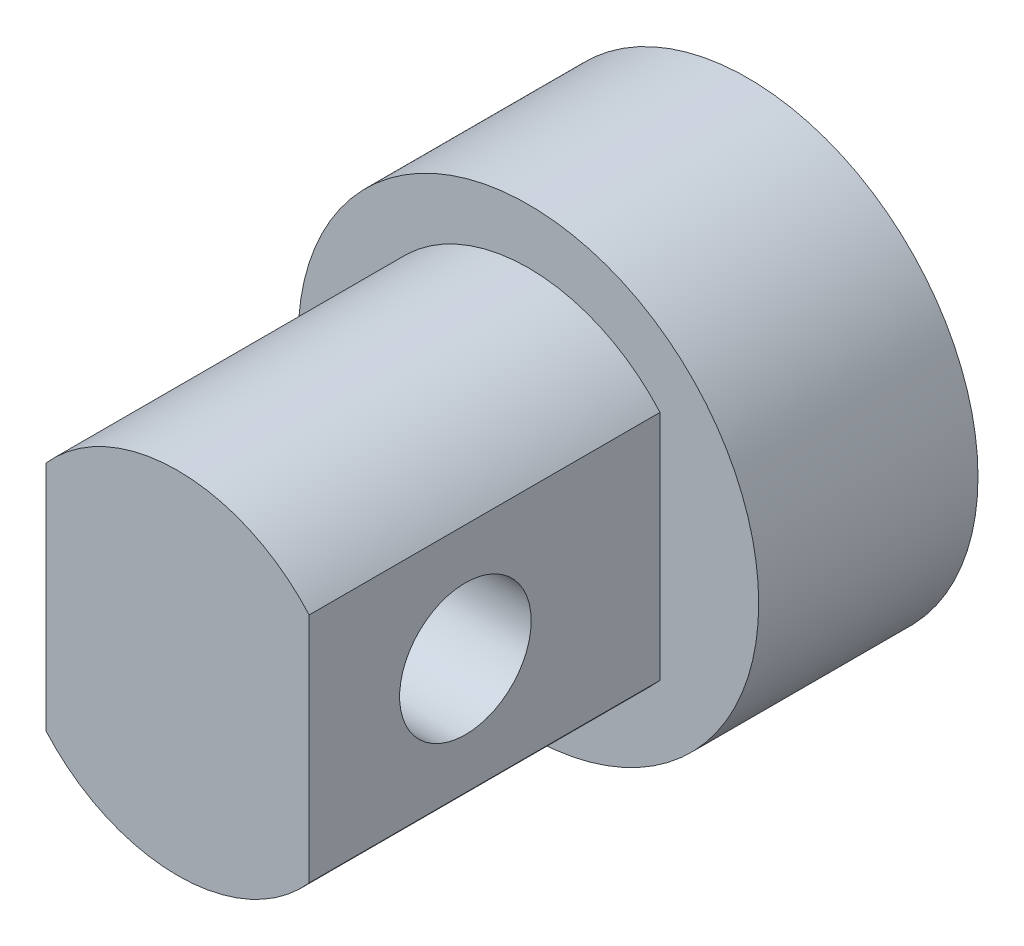
ISO-10303-21;
HEADER;
FILE_DESCRIPTION(('STEP AP214'),'2;1');
FILE_NAME('part.step','',(''),(''),'','','');
FILE_SCHEMA(('AUTOMOTIVE_DESIGN { 1 0 10303 214 1 1 1 1 }'));
ENDSEC;
DATA;
#1=APPLICATION_CONTEXT('core data for automotive mechanical design processes');
#2=APPLICATION_PROTOCOL_DEFINITION('international standard','automotive_design',2000,#1);
#3=PRODUCT_CONTEXT('',#1,'mechanical');
#4=PRODUCT('Part','Part','',(#3));
#5=PRODUCT_RELATED_PRODUCT_CATEGORY('part','',(#4));
#6=PRODUCT_DEFINITION_FORMATION('','',#4);
#7=PRODUCT_DEFINITION_CONTEXT('part definition',#1,'design');
#8=PRODUCT_DEFINITION('design','',#6,#7);
#9=PRODUCT_DEFINITION_SHAPE('','',#8);
#10=(LENGTH_UNIT() NAMED_UNIT(*) SI_UNIT(.MILLI.,.METRE.));
#11=(NAMED_UNIT(*) PLANE_ANGLE_UNIT() SI_UNIT($,.RADIAN.));
#12=(NAMED_UNIT(*) SI_UNIT($,.STERADIAN.) SOLID_ANGLE_UNIT());
#13=UNCERTAINTY_MEASURE_WITH_UNIT(LENGTH_MEASURE(1.E-05),#10,'distance_accuracy_value','');
#14=(GEOMETRIC_REPRESENTATION_CONTEXT(3) GLOBAL_UNCERTAINTY_ASSIGNED_CONTEXT((#13)) GLOBAL_UNIT_ASSIGNED_CONTEXT((#10,
#11,#12)) REPRESENTATION_CONTEXT('',''));
#15=CARTESIAN_POINT('',(0.,0.,0.));
#16=DIRECTION('',(0.,0.,1.));
#17=DIRECTION('',(1.,0.,0.));
#18=AXIS2_PLACEMENT_3D('',#15,#16,#17);
#19=CARTESIAN_POINT('',(0.,0.,16.));
#20=DIRECTION('',(0.,0.,-1.));
#21=DIRECTION('',(-1.,0.,0.));
#22=AXIS2_PLACEMENT_3D('',#19,#20,#21);
#23=CYLINDRICAL_SURFACE('',#22,8.);
#24=CARTESIAN_POINT('',(0.,0.,0.));
#25=DIRECTION('',(0.,0.,1.));
#26=DIRECTION('',(1.,0.,0.));
#27=AXIS2_PLACEMENT_3D('',#24,#25,#26);
#28=CIRCLE('',#27,8.);
#29=CARTESIAN_POINT('',(-6.,-5.29150262212918,0.));
#30=VERTEX_POINT('',#29);
#31=CARTESIAN_POINT('',(6.,-5.29150262212918,0.));
#32=VERTEX_POINT('',#31);
#33=EDGE_CURVE('E76',#30,#32,#28,.T.);
#34=ORIENTED_EDGE('',*,*,#33,.T.);
#35=DIRECTION('',(0.,0.,-1.));
#36=VECTOR('',#35,1.);
#37=CARTESIAN_POINT('',(6.,-5.29150262212918,16.));
#38=LINE('',#37,#36);
#39=CARTESIAN_POINT('',(6.,-5.29150262212918,16.));
#40=VERTEX_POINT('',#39);
#41=EDGE_CURVE('E11',#40,#32,#38,.T.);
#42=ORIENTED_EDGE('',*,*,#41,.F.);
#43=CARTESIAN_POINT('',(0.,0.,16.));
#44=DIRECTION('',(0.,0.,1.));
#45=DIRECTION('',(1.,0.,0.));
#46=AXIS2_PLACEMENT_3D('',#43,#44,#45);
#47=CIRCLE('',#46,8.);
#48=CARTESIAN_POINT('',(-6.,-5.29150262212918,16.));
#49=VERTEX_POINT('',#48);
#50=EDGE_CURVE('E80',#49,#40,#47,.T.);
#51=ORIENTED_EDGE('',*,*,#50,.F.);
#52=DIRECTION('',(0.,0.,-1.));
#53=VECTOR('',#52,1.);
#54=CARTESIAN_POINT('',(-6.,-5.29150262212918,16.));
#55=LINE('',#54,#53);
#56=EDGE_CURVE('E92',#49,#30,#55,.T.);
#57=ORIENTED_EDGE('',*,*,#56,.T.);
#58=EDGE_LOOP('',(#34,#42,#51,#57));
#59=FACE_BOUND('',#58,.T.);
#60=ADVANCED_FACE('F33',(#59),#23,.T.);
#61=CARTESIAN_POINT('',(6.,5.29150262212918,16.));
#62=DIRECTION('',(-1.,0.,0.));
#63=DIRECTION('',(0.,-1.,0.));
#64=AXIS2_PLACEMENT_3D('',#61,#62,#63);
#65=PLANE('',#64);
#66=CARTESIAN_POINT('',(6.,0.,8.87546842750701));
#67=DIRECTION('',(-1.,0.,0.));
#68=DIRECTION('',(0.,-1.,0.));
#69=AXIS2_PLACEMENT_3D('',#66,#67,#68);
#70=CIRCLE('',#69,3.);
#71=CARTESIAN_POINT('',(6.,0.,5.87546842750701));
#72=VERTEX_POINT('',#71);
#73=EDGE_CURVE('E109',#72,#72,#70,.T.);
#74=ORIENTED_EDGE('',*,*,#73,.T.);
#75=EDGE_LOOP('',(#74));
#76=FACE_BOUND('',#75,.T.);
#77=DIRECTION('',(0.,1.,0.));
#78=VECTOR('',#77,1.);
#79=CARTESIAN_POINT('',(6.,5.29150262212918,0.));
#80=LINE('',#79,#78);
#81=CARTESIAN_POINT('',(6.,5.29150262212918,0.));
#82=VERTEX_POINT('',#81);
#83=EDGE_CURVE('E89',#32,#82,#80,.T.);
#84=ORIENTED_EDGE('',*,*,#83,.T.);
#85=DIRECTION('',(0.,0.,-1.));
#86=VECTOR('',#85,1.);
#87=CARTESIAN_POINT('',(6.,5.29150262212918,16.));
#88=LINE('',#87,#86);
#89=CARTESIAN_POINT('',(6.,5.29150262212918,16.));
#90=VERTEX_POINT('',#89);
#91=EDGE_CURVE('E42',#90,#82,#88,.T.);
#92=ORIENTED_EDGE('',*,*,#91,.F.);
#93=DIRECTION('',(0.,1.,0.));
#94=VECTOR('',#93,1.);
#95=CARTESIAN_POINT('',(6.,5.29150262212918,16.));
#96=LINE('',#95,#94);
#97=EDGE_CURVE('E103',#40,#90,#96,.T.);
#98=ORIENTED_EDGE('',*,*,#97,.F.);
#99=ORIENTED_EDGE('',*,*,#41,.T.);
#100=EDGE_LOOP('',(#84,#92,#98,#99));
#101=FACE_BOUND('',#100,.T.);
#102=ADVANCED_FACE('F131',(#76,#101),#65,.F.);
#103=CARTESIAN_POINT('',(0.,0.,16.));
#104=DIRECTION('',(0.,0.,-1.));
#105=DIRECTION('',(-1.,0.,0.));
#106=AXIS2_PLACEMENT_3D('',#103,#104,#105);
#107=CYLINDRICAL_SURFACE('',#106,8.);
#108=CARTESIAN_POINT('',(0.,0.,0.));
#109=DIRECTION('',(0.,0.,1.));
#110=DIRECTION('',(1.,0.,0.));
#111=AXIS2_PLACEMENT_3D('',#108,#109,#110);
#112=CIRCLE('',#111,8.);
#113=CARTESIAN_POINT('',(-6.,5.29150262212918,0.));
#114=VERTEX_POINT('',#113);
#115=EDGE_CURVE('E73',#82,#114,#112,.T.);
#116=ORIENTED_EDGE('',*,*,#115,.T.);
#117=DIRECTION('',(0.,0.,-1.));
#118=VECTOR('',#117,1.);
#119=CARTESIAN_POINT('',(-6.,5.29150262212918,16.));
#120=LINE('',#119,#118);
#121=CARTESIAN_POINT('',(-6.,5.29150262212918,16.));
#122=VERTEX_POINT('',#121);
#123=EDGE_CURVE('E87',#122,#114,#120,.T.);
#124=ORIENTED_EDGE('',*,*,#123,.F.);
#125=CARTESIAN_POINT('',(0.,0.,16.));
#126=DIRECTION('',(0.,0.,1.));
#127=DIRECTION('',(1.,0.,0.));
#128=AXIS2_PLACEMENT_3D('',#125,#126,#127);
#129=CIRCLE('',#128,8.);
#130=EDGE_CURVE('E101',#90,#122,#129,.T.);
#131=ORIENTED_EDGE('',*,*,#130,.F.);
#132=ORIENTED_EDGE('',*,*,#91,.T.);
#133=EDGE_LOOP('',(#116,#124,#131,#132));
#134=FACE_BOUND('',#133,.T.);
#135=ADVANCED_FACE('F85',(#134),#107,.T.);
#136=CARTESIAN_POINT('',(-6.,5.29150262212918,16.));
#137=DIRECTION('',(1.,0.,0.));
#138=DIRECTION('',(0.,1.,0.));
#139=AXIS2_PLACEMENT_3D('',#136,#137,#138);
#140=PLANE('',#139);
#141=CARTESIAN_POINT('',(-6.,0.,8.87546842750701));
#142=DIRECTION('',(1.,0.,0.));
#143=DIRECTION('',(0.,1.,0.));
#144=AXIS2_PLACEMENT_3D('',#141,#142,#143);
#145=CIRCLE('',#144,3.);
#146=CARTESIAN_POINT('',(-6.,0.,5.87546842750701));
#147=VERTEX_POINT('',#146);
#148=EDGE_CURVE('E36',#147,#147,#145,.T.);
#149=ORIENTED_EDGE('',*,*,#148,.T.);
#150=EDGE_LOOP('',(#149));
#151=FACE_BOUND('',#150,.T.);
#152=DIRECTION('',(0.,-1.,0.));
#153=VECTOR('',#152,1.);
#154=CARTESIAN_POINT('',(-6.,5.29150262212918,0.));
#155=LINE('',#154,#153);
#156=EDGE_CURVE('E70',#114,#30,#155,.T.);
#157=ORIENTED_EDGE('',*,*,#156,.T.);
#158=ORIENTED_EDGE('',*,*,#56,.F.);
#159=DIRECTION('',(0.,-1.,0.));
#160=VECTOR('',#159,1.);
#161=CARTESIAN_POINT('',(-6.,5.29150262212918,16.));
#162=LINE('',#161,#160);
#163=EDGE_CURVE('E49',#122,#49,#162,.T.);
#164=ORIENTED_EDGE('',*,*,#163,.F.);
#165=ORIENTED_EDGE('',*,*,#123,.T.);
#166=EDGE_LOOP('',(#157,#158,#164,#165));
#167=FACE_BOUND('',#166,.T.);
#168=ADVANCED_FACE('F91',(#151,#167),#140,.F.);
#169=CARTESIAN_POINT('',(0.,0.,16.));
#170=DIRECTION('',(0.,0.,1.));
#171=DIRECTION('',(1.,0.,0.));
#172=AXIS2_PLACEMENT_3D('',#169,#170,#171);
#173=PLANE('',#172);
#174=ORIENTED_EDGE('',*,*,#50,.T.);
#175=ORIENTED_EDGE('',*,*,#97,.T.);
#176=ORIENTED_EDGE('',*,*,#130,.T.);
#177=ORIENTED_EDGE('',*,*,#163,.T.);
#178=EDGE_LOOP('',(#174,#175,#176,#177));
#179=FACE_BOUND('',#178,.T.);
#180=ADVANCED_FACE('F138',(#179),#173,.T.);
#181=CARTESIAN_POINT('',(0.,0.,0.));
#182=DIRECTION('',(0.,0.,1.));
#183=DIRECTION('',(1.,0.,0.));
#184=AXIS2_PLACEMENT_3D('',#181,#182,#183);
#185=PLANE('',#184);
#186=CARTESIAN_POINT('',(0.,0.,0.));
#187=DIRECTION('',(0.,0.,1.));
#188=DIRECTION('',(1.,0.,0.));
#189=AXIS2_PLACEMENT_3D('',#186,#187,#188);
#190=CIRCLE('',#189,10.5);
#191=CARTESIAN_POINT('',(10.5,0.,0.));
#192=VERTEX_POINT('',#191);
#193=EDGE_CURVE('E106',#192,#192,#190,.T.);
#194=ORIENTED_EDGE('',*,*,#193,.T.);
#195=EDGE_LOOP('',(#194));
#196=FACE_BOUND('',#195,.T.);
#197=ORIENTED_EDGE('',*,*,#33,.F.);
#198=ORIENTED_EDGE('',*,*,#156,.F.);
#199=ORIENTED_EDGE('',*,*,#115,.F.);
#200=ORIENTED_EDGE('',*,*,#83,.F.);
#201=EDGE_LOOP('',(#197,#198,#199,#200));
#202=FACE_BOUND('',#201,.T.);
#203=ADVANCED_FACE('F72',(#196,#202),#185,.T.);
#204=CARTESIAN_POINT('',(0.,0.,-10.));
#205=DIRECTION('',(0.,0.,1.));
#206=DIRECTION('',(1.,0.,0.));
#207=AXIS2_PLACEMENT_3D('',#204,#205,#206);
#208=CYLINDRICAL_SURFACE('',#207,10.5);
#209=CARTESIAN_POINT('',(0.,0.,-10.));
#210=DIRECTION('',(0.,0.,1.));
#211=DIRECTION('',(1.,0.,0.));
#212=AXIS2_PLACEMENT_3D('',#209,#210,#211);
#213=CIRCLE('',#212,10.5);
#214=CARTESIAN_POINT('',(10.5,0.,-10.));
#215=VERTEX_POINT('',#214);
#216=EDGE_CURVE('E99',#215,#215,#213,.T.);
#217=ORIENTED_EDGE('',*,*,#216,.T.);
#218=EDGE_LOOP('',(#217));
#219=FACE_BOUND('',#218,.T.);
#220=ORIENTED_EDGE('',*,*,#193,.F.);
#221=EDGE_LOOP('',(#220));
#222=FACE_BOUND('',#221,.T.);
#223=ADVANCED_FACE('F127',(#219,#222),#208,.T.);
#224=CARTESIAN_POINT('',(0.,0.,-10.));
#225=DIRECTION('',(0.,0.,1.));
#226=DIRECTION('',(1.,0.,0.));
#227=AXIS2_PLACEMENT_3D('',#224,#225,#226);
#228=PLANE('',#227);
#229=ORIENTED_EDGE('',*,*,#216,.F.);
#230=EDGE_LOOP('',(#229));
#231=FACE_BOUND('',#230,.T.);
#232=ADVANCED_FACE('F122',(#231),#228,.F.);
#233=CARTESIAN_POINT('',(-10.5,0.,8.87546842750701));
#234=DIRECTION('',(1.,0.,0.));
#235=DIRECTION('',(0.,0.,-1.));
#236=AXIS2_PLACEMENT_3D('',#233,#234,#235);
#237=CYLINDRICAL_SURFACE('',#236,3.);
#238=CARTESIAN_POINT('',(-6.,0.,5.87546842750701));
#239=CARTESIAN_POINT('',(-5.875,0.,5.87546842750701));
#240=CARTESIAN_POINT('',(-5.75,0.,5.87546842750701));
#241=CARTESIAN_POINT('',(-5.5,0.,5.87546842750701));
#242=CARTESIAN_POINT('',(-5.375,0.,5.87546842750701));
#243=CARTESIAN_POINT('',(-5.125,0.,5.87546842750701));
#244=CARTESIAN_POINT('',(-5.,0.,5.87546842750701));
#245=CARTESIAN_POINT('',(-4.75,0.,5.87546842750701));
#246=CARTESIAN_POINT('',(-4.625,0.,5.87546842750701));
#247=CARTESIAN_POINT('',(-4.375,0.,5.87546842750701));
#248=CARTESIAN_POINT('',(-4.25,0.,5.87546842750701));
#249=CARTESIAN_POINT('',(-4.,0.,5.87546842750701));
#250=CARTESIAN_POINT('',(-3.875,0.,5.87546842750701));
#251=CARTESIAN_POINT('',(-3.625,0.,5.87546842750701));
#252=CARTESIAN_POINT('',(-3.5,0.,5.87546842750701));
#253=CARTESIAN_POINT('',(-3.25,0.,5.87546842750701));
#254=CARTESIAN_POINT('',(-3.125,0.,5.87546842750701));
#255=CARTESIAN_POINT('',(-2.875,0.,5.87546842750701));
#256=CARTESIAN_POINT('',(-2.75,0.,5.87546842750701));
#257=CARTESIAN_POINT('',(-2.5,0.,5.87546842750701));
#258=CARTESIAN_POINT('',(-2.375,0.,5.87546842750701));
#259=CARTESIAN_POINT('',(-2.125,0.,5.87546842750701));
#260=CARTESIAN_POINT('',(-2.,0.,5.87546842750701));
#261=CARTESIAN_POINT('',(-1.75,0.,5.87546842750701));
#262=CARTESIAN_POINT('',(-1.625,0.,5.87546842750701));
#263=CARTESIAN_POINT('',(-1.375,0.,5.87546842750701));
#264=CARTESIAN_POINT('',(-1.25,0.,5.87546842750701));
#265=CARTESIAN_POINT('',(-1.,0.,5.87546842750701));
#266=CARTESIAN_POINT('',(-0.875000000000001,0.,5.87546842750701));
#267=CARTESIAN_POINT('',(-0.625000000000001,0.,5.87546842750701));
#268=CARTESIAN_POINT('',(-0.5,0.,5.87546842750701));
#269=CARTESIAN_POINT('',(-0.25,0.,5.87546842750701));
#270=CARTESIAN_POINT('',(-0.125,0.,5.87546842750701));
#271=CARTESIAN_POINT('',(0.125,0.,5.87546842750701));
#272=CARTESIAN_POINT('',(0.25,0.,5.87546842750701));
#273=CARTESIAN_POINT('',(0.5,0.,5.87546842750701));
#274=CARTESIAN_POINT('',(0.625000000000001,0.,5.87546842750701));
#275=CARTESIAN_POINT('',(0.875000000000001,0.,5.87546842750701));
#276=CARTESIAN_POINT('',(1.,0.,5.87546842750701));
#277=CARTESIAN_POINT('',(1.25,0.,5.87546842750701));
#278=CARTESIAN_POINT('',(1.375,0.,5.87546842750701));
#279=CARTESIAN_POINT('',(1.625,0.,5.87546842750701));
#280=CARTESIAN_POINT('',(1.75,0.,5.87546842750701));
#281=CARTESIAN_POINT('',(2.,0.,5.87546842750701));
#282=CARTESIAN_POINT('',(2.125,0.,5.87546842750701));
#283=CARTESIAN_POINT('',(2.375,0.,5.87546842750701));
#284=CARTESIAN_POINT('',(2.5,0.,5.87546842750701));
#285=CARTESIAN_POINT('',(2.75,0.,5.87546842750701));
#286=CARTESIAN_POINT('',(2.875,0.,5.87546842750701));
#287=CARTESIAN_POINT('',(3.125,0.,5.87546842750701));
#288=CARTESIAN_POINT('',(3.25,0.,5.87546842750701));
#289=CARTESIAN_POINT('',(3.5,0.,5.87546842750701));
#290=CARTESIAN_POINT('',(3.625,0.,5.87546842750701));
#291=CARTESIAN_POINT('',(3.875,0.,5.87546842750701));
#292=CARTESIAN_POINT('',(4.,0.,5.87546842750701));
#293=CARTESIAN_POINT('',(4.25,0.,5.87546842750701));
#294=CARTESIAN_POINT('',(4.375,0.,5.87546842750701));
#295=CARTESIAN_POINT('',(4.625,0.,5.87546842750701));
#296=CARTESIAN_POINT('',(4.75,0.,5.87546842750701));
#297=CARTESIAN_POINT('',(5.,0.,5.87546842750701));
#298=CARTESIAN_POINT('',(5.125,0.,5.87546842750701));
#299=CARTESIAN_POINT('',(5.375,0.,5.87546842750701));
#300=CARTESIAN_POINT('',(5.5,0.,5.87546842750701));
#301=CARTESIAN_POINT('',(5.75,0.,5.87546842750701));
#302=CARTESIAN_POINT('',(5.875,0.,5.87546842750701));
#303=CARTESIAN_POINT('',(6.,0.,5.87546842750701));
#304=B_SPLINE_CURVE_WITH_KNOTS('',3,(#238,#239,#240,#241,#242,#243,#244,#245,#246,#247,#248,
#249,#250,#251,#252,#253,#254,#255,#256,#257,#258,#259,#260,#261,#262,#263,#264,#265,#266,#267,
#268,#269,#270,#271,#272,#273,#274,#275,#276,#277,#278,#279,#280,#281,#282,#283,#284,#285,#286,
#287,#288,#289,#290,#291,#292,#293,#294,#295,#296,#297,#298,#299,#300,#301,#302,#303),
.UNSPECIFIED.,.F.,.F.,(4,2,2,2,2,2,2,2,2,2,2,2,2,2,2,2,2,2,2,2,2,2,2,2,2,2,2,2,2,2,2,2,4),(0.,
0.375,0.750000000000001,1.125,1.5,1.875,2.25,2.625,3.,3.375,3.75,4.125,4.5,4.875,5.25,5.625,6.,
6.375,6.75,7.125,7.5,7.875,8.25,8.625,9.00000000000001,9.37500000000001,9.75000000000001,10.125,
10.5,10.875,11.25,11.625,12.),.UNSPECIFIED.);
#305=EDGE_CURVE('BSEAM119',#147,#72,#304,.T.);
#306=ORIENTED_EDGE('',*,*,#148,.F.);
#307=ORIENTED_EDGE('',*,*,#73,.F.);
#308=ORIENTED_EDGE('',*,*,#305,.T.);
#309=ORIENTED_EDGE('',*,*,#305,.F.);
#310=EDGE_LOOP('',(#306,#308,#307,#309));
#311=FACE_BOUND('',#310,.T.);
#312=ADVANCED_FACE('F119',(#311),#237,.F.);
#313=CLOSED_SHELL('',(#60,#102,#135,#168,#180,#203,#223,#232,#312));
#314=MANIFOLD_SOLID_BREP('B2',#313);
#315=ADVANCED_BREP_SHAPE_REPRESENTATION('',(#18,#314),#14);
#316=SHAPE_DEFINITION_REPRESENTATION(#9,#315);
ENDSEC;
END-ISO-10303-21;
